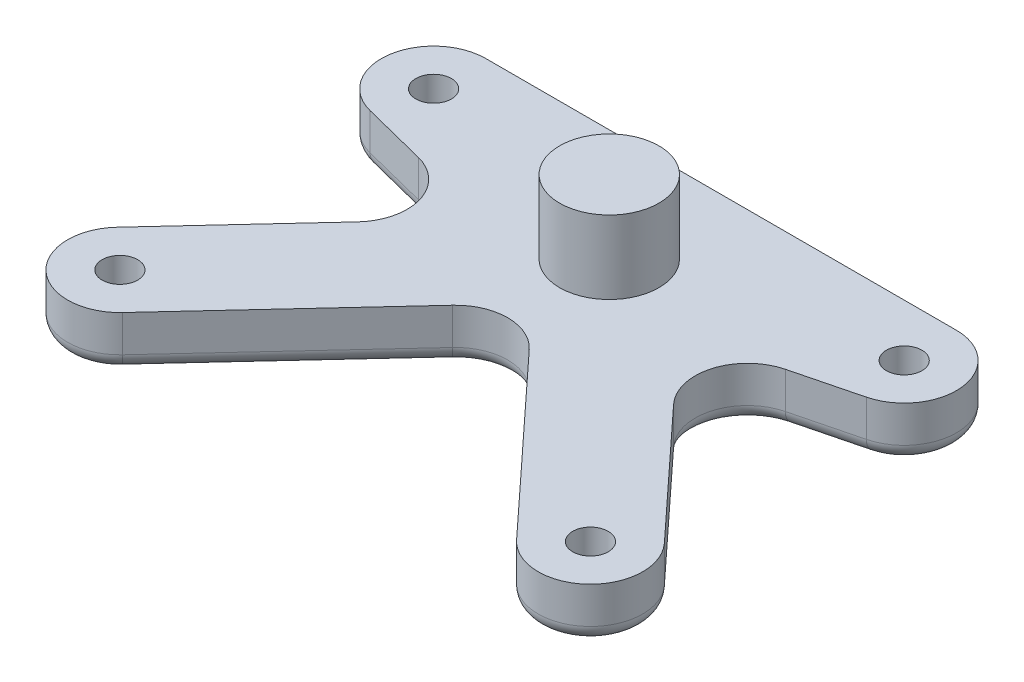
ISO-10303-21;
HEADER;
FILE_DESCRIPTION(('STEP AP214'),'2;1');
FILE_NAME('part.step','',(''),(''),'','','');
FILE_SCHEMA(('AUTOMOTIVE_DESIGN { 1 0 10303 214 1 1 1 1 }'));
ENDSEC;
DATA;
#1=APPLICATION_CONTEXT('core data for automotive mechanical design processes');
#2=APPLICATION_PROTOCOL_DEFINITION('international standard','automotive_design',2000,#1);
#3=PRODUCT_CONTEXT('',#1,'mechanical');
#4=PRODUCT('Part','Part','',(#3));
#5=PRODUCT_RELATED_PRODUCT_CATEGORY('part','',(#4));
#6=PRODUCT_DEFINITION_FORMATION('','',#4);
#7=PRODUCT_DEFINITION_CONTEXT('part definition',#1,'design');
#8=PRODUCT_DEFINITION('design','',#6,#7);
#9=PRODUCT_DEFINITION_SHAPE('','',#8);
#10=(LENGTH_UNIT() NAMED_UNIT(*) SI_UNIT(.MILLI.,.METRE.));
#11=(NAMED_UNIT(*) PLANE_ANGLE_UNIT() SI_UNIT($,.RADIAN.));
#12=(NAMED_UNIT(*) SI_UNIT($,.STERADIAN.) SOLID_ANGLE_UNIT());
#13=UNCERTAINTY_MEASURE_WITH_UNIT(LENGTH_MEASURE(1.E-05),#10,'distance_accuracy_value','');
#14=(GEOMETRIC_REPRESENTATION_CONTEXT(3) GLOBAL_UNCERTAINTY_ASSIGNED_CONTEXT((#13)) GLOBAL_UNIT_ASSIGNED_CONTEXT((#10,
#11,#12)) REPRESENTATION_CONTEXT('',''));
#15=CARTESIAN_POINT('',(0.,0.,0.));
#16=DIRECTION('',(0.,0.,1.));
#17=DIRECTION('',(1.,0.,0.));
#18=AXIS2_PLACEMENT_3D('',#15,#16,#17);
#19=CARTESIAN_POINT('',(-22.5,5.,15.));
#20=DIRECTION('',(0.,1.,0.));
#21=DIRECTION('',(0.,0.,1.));
#22=AXIS2_PLACEMENT_3D('',#19,#20,#21);
#23=PLANE('',#22);
#24=CARTESIAN_POINT('',(0.,5.,-9.3));
#25=DIRECTION('',(0.,1.,0.));
#26=DIRECTION('',(0.,0.,1.));
#27=AXIS2_PLACEMENT_3D('',#24,#25,#26);
#28=CIRCLE('',#27,4.75);
#29=CARTESIAN_POINT('',(0.,5.,-4.55));
#30=VERTEX_POINT('',#29);
#31=EDGE_CURVE('E355',#30,#30,#28,.T.);
#32=ORIENTED_EDGE('',*,*,#31,.F.);
#33=EDGE_LOOP('',(#32));
#34=FACE_BOUND('',#33,.T.);
#35=CARTESIAN_POINT('',(-22.5,5.,-15.));
#36=DIRECTION('',(0.,1.,0.));
#37=DIRECTION('',(0.,0.,1.));
#38=AXIS2_PLACEMENT_3D('',#35,#36,#37);
#39=CIRCLE('',#38,1.7);
#40=CARTESIAN_POINT('',(-22.5,5.,-13.3));
#41=VERTEX_POINT('',#40);
#42=EDGE_CURVE('E379',#41,#41,#39,.T.);
#43=ORIENTED_EDGE('',*,*,#42,.F.);
#44=EDGE_LOOP('',(#43));
#45=FACE_BOUND('',#44,.T.);
#46=CARTESIAN_POINT('',(22.5,5.,-15.));
#47=DIRECTION('',(0.,1.,0.));
#48=DIRECTION('',(0.,0.,1.));
#49=AXIS2_PLACEMENT_3D('',#46,#47,#48);
#50=CIRCLE('',#49,1.69999999999999);
#51=CARTESIAN_POINT('',(22.5,5.,-13.3));
#52=VERTEX_POINT('',#51);
#53=EDGE_CURVE('E209',#52,#52,#50,.T.);
#54=ORIENTED_EDGE('',*,*,#53,.F.);
#55=EDGE_LOOP('',(#54));
#56=FACE_BOUND('',#55,.T.);
#57=CARTESIAN_POINT('',(-22.5,5.,15.));
#58=DIRECTION('',(0.,1.,0.));
#59=DIRECTION('',(0.,0.,1.));
#60=AXIS2_PLACEMENT_3D('',#57,#58,#59);
#61=CIRCLE('',#60,5.00000000000001);
#62=CARTESIAN_POINT('',(-26.1688033700915,5.,11.6029598425089));
#63=VERTEX_POINT('',#62);
#64=CARTESIAN_POINT('',(-18.8311966299096,5.,18.3970401574917));
#65=VERTEX_POINT('',#64);
#66=EDGE_CURVE('E199',#63,#65,#61,.T.);
#67=ORIENTED_EDGE('',*,*,#66,.T.);
#68=DIRECTION('',(0.679408031498311,0.,-0.733760674018164));
#69=VECTOR('',#68,1.);
#70=CARTESIAN_POINT('',(-18.8311966299096,5.,18.3970401574917));
#71=LINE('',#70,#69);
#72=CARTESIAN_POINT('',(-3.66880337009109,5.,2.02165543688799));
#73=VERTEX_POINT('',#72);
#74=EDGE_CURVE('E187',#65,#73,#71,.T.);
#75=ORIENTED_EDGE('',*,*,#74,.T.);
#76=CARTESIAN_POINT('',(0.,5.,5.41869559437926));
#77=DIRECTION('',(0.,-1.,0.));
#78=DIRECTION('',(0.,0.,1.));
#79=AXIS2_PLACEMENT_3D('',#76,#77,#78);
#80=CIRCLE('',#79,5.);
#81=CARTESIAN_POINT('',(3.66880337009086,5.,2.02165543688777));
#82=VERTEX_POINT('',#81);
#83=EDGE_CURVE('E198',#73,#82,#80,.T.);
#84=ORIENTED_EDGE('',*,*,#83,.T.);
#85=DIRECTION('',(0.679408031498305,0.,0.733760674018169));
#86=VECTOR('',#85,1.);
#87=CARTESIAN_POINT('',(3.66880337009086,5.,2.02165543688777));
#88=LINE('',#87,#86);
#89=CARTESIAN_POINT('',(18.8311966299092,5.,18.3970401574915));
#90=VERTEX_POINT('',#89);
#91=EDGE_CURVE('E403',#82,#90,#88,.T.);
#92=ORIENTED_EDGE('',*,*,#91,.T.);
#93=CARTESIAN_POINT('',(22.5,5.,15.));
#94=DIRECTION('',(0.,1.,0.));
#95=DIRECTION('',(0.,0.,1.));
#96=AXIS2_PLACEMENT_3D('',#93,#94,#95);
#97=CIRCLE('',#96,5.);
#98=CARTESIAN_POINT('',(26.1688033700909,5.,11.6029598425085));
#99=VERTEX_POINT('',#98);
#100=EDGE_CURVE('E406',#90,#99,#97,.T.);
#101=ORIENTED_EDGE('',*,*,#100,.T.);
#102=DIRECTION('',(-0.679408031498341,0.,-0.733760674018136));
#103=VECTOR('',#102,1.);
#104=CARTESIAN_POINT('',(15.1071427792466,5.,-0.343633595602185));
#105=LINE('',#104,#103);
#106=CARTESIAN_POINT('',(15.1071427792465,5.,-0.34363359560214));
#107=VERTEX_POINT('',#106);
#108=EDGE_CURVE('E409',#99,#107,#105,.T.);
#109=ORIENTED_EDGE('',*,*,#108,.T.);
#110=CARTESIAN_POINT('',(18.7759461493373,5.,-3.74067375309363));
#111=DIRECTION('',(0.,-1.,0.));
#112=DIRECTION('',(0.,0.,-1.));
#113=AXIS2_PLACEMENT_3D('',#110,#111,#112);
#114=CIRCLE('',#113,4.99999999999995);
#115=CARTESIAN_POINT('',(17.5480680619874,5.,-8.58756094000093));
#116=VERTEX_POINT('',#115);
#117=EDGE_CURVE('E412',#107,#116,#114,.T.);
#118=ORIENTED_EDGE('',*,*,#117,.T.);
#119=DIRECTION('',(0.969377437381459,0.,-0.245575617469966));
#120=VECTOR('',#119,1.);
#121=CARTESIAN_POINT('',(23.7278780873499,5.,-10.1531128130927));
#122=LINE('',#121,#120);
#123=CARTESIAN_POINT('',(23.7278780873499,5.,-10.1531128130927));
#124=VERTEX_POINT('',#123);
#125=EDGE_CURVE('E415',#116,#124,#122,.T.);
#126=ORIENTED_EDGE('',*,*,#125,.T.);
#127=CARTESIAN_POINT('',(22.5,5.,-15.));
#128=DIRECTION('',(0.,1.,0.));
#129=DIRECTION('',(0.,0.,1.));
#130=AXIS2_PLACEMENT_3D('',#127,#128,#129);
#131=CIRCLE('',#130,5.);
#132=CARTESIAN_POINT('',(22.5,5.,-20.));
#133=VERTEX_POINT('',#132);
#134=EDGE_CURVE('E418',#124,#133,#131,.T.);
#135=ORIENTED_EDGE('',*,*,#134,.T.);
#136=DIRECTION('',(-1.,0.,0.));
#137=VECTOR('',#136,1.);
#138=CARTESIAN_POINT('',(-22.5,5.,-20.));
#139=LINE('',#138,#137);
#140=CARTESIAN_POINT('',(-22.5,5.,-20.));
#141=VERTEX_POINT('',#140);
#142=EDGE_CURVE('E421',#133,#141,#139,.T.);
#143=ORIENTED_EDGE('',*,*,#142,.T.);
#144=CARTESIAN_POINT('',(-22.5,5.,-15.));
#145=DIRECTION('',(0.,1.,0.));
#146=DIRECTION('',(0.,0.,1.));
#147=AXIS2_PLACEMENT_3D('',#144,#145,#146);
#148=CIRCLE('',#147,5.);
#149=CARTESIAN_POINT('',(-23.7278780873506,5.,-10.1531128130929));
#150=VERTEX_POINT('',#149);
#151=EDGE_CURVE('E424',#141,#150,#148,.T.);
#152=ORIENTED_EDGE('',*,*,#151,.T.);
#153=DIRECTION('',(0.969377437381453,0.,0.245575617469989));
#154=VECTOR('',#153,1.);
#155=CARTESIAN_POINT('',(-23.7278780873506,5.,-10.1531128130929));
#156=LINE('',#155,#154);
#157=CARTESIAN_POINT('',(-17.5480680619892,5.,-8.58756094000132));
#158=VERTEX_POINT('',#157);
#159=EDGE_CURVE('E427',#150,#158,#156,.T.);
#160=ORIENTED_EDGE('',*,*,#159,.T.);
#161=CARTESIAN_POINT('',(-18.7759461493394,5.,-3.74067375309387));
#162=DIRECTION('',(0.,-1.,0.));
#163=DIRECTION('',(0.,0.,1.));
#164=AXIS2_PLACEMENT_3D('',#161,#162,#163);
#165=CIRCLE('',#164,5.00000000000022);
#166=CARTESIAN_POINT('',(-15.107142779248,5.,-0.343633595602444));
#167=VERTEX_POINT('',#166);
#168=EDGE_CURVE('E430',#158,#167,#165,.T.);
#169=ORIENTED_EDGE('',*,*,#168,.T.);
#170=DIRECTION('',(-0.679408031498295,0.,0.733760674018178));
#171=VECTOR('',#170,1.);
#172=CARTESIAN_POINT('',(-26.1688033700915,5.,11.6029598425089));
#173=LINE('',#172,#171);
#174=EDGE_CURVE('E204',#167,#63,#173,.T.);
#175=ORIENTED_EDGE('',*,*,#174,.T.);
#176=EDGE_LOOP('',(#67,#75,#84,#92,#101,#109,#118,#126,#135,#143,#152,#160,#169,#175));
#177=FACE_BOUND('',#176,.T.);
#178=CARTESIAN_POINT('',(22.5,5.,15.));
#179=DIRECTION('',(0.,1.,0.));
#180=DIRECTION('',(0.,0.,1.));
#181=AXIS2_PLACEMENT_3D('',#178,#179,#180);
#182=CIRCLE('',#181,1.7);
#183=CARTESIAN_POINT('',(22.5,5.,16.7));
#184=VERTEX_POINT('',#183);
#185=EDGE_CURVE('E387',#184,#184,#182,.T.);
#186=ORIENTED_EDGE('',*,*,#185,.F.);
#187=EDGE_LOOP('',(#186));
#188=FACE_BOUND('',#187,.T.);
#189=CARTESIAN_POINT('',(-22.5,5.,15.));
#190=DIRECTION('',(0.,1.,0.));
#191=DIRECTION('',(0.,0.,1.));
#192=AXIS2_PLACEMENT_3D('',#189,#190,#191);
#193=CIRCLE('',#192,1.7);
#194=CARTESIAN_POINT('',(-22.5,5.,16.7));
#195=VERTEX_POINT('',#194);
#196=EDGE_CURVE('E371',#195,#195,#193,.T.);
#197=ORIENTED_EDGE('',*,*,#196,.F.);
#198=EDGE_LOOP('',(#197));
#199=FACE_BOUND('',#198,.T.);
#200=ADVANCED_FACE('F41',(#34,#45,#56,#177,#188,#199),#23,.T.);
#201=CARTESIAN_POINT('',(-22.5,0.,15.));
#202=DIRECTION('',(0.,1.,0.));
#203=DIRECTION('',(0.,0.,1.));
#204=AXIS2_PLACEMENT_3D('',#201,#202,#203);
#205=PLANE('',#204);
#206=DIRECTION('',(-1.,0.,0.));
#207=VECTOR('',#206,1.);
#208=CARTESIAN_POINT('',(-22.5,0.,-18.5));
#209=LINE('',#208,#207);
#210=CARTESIAN_POINT('',(-22.5,0.,-18.5));
#211=VERTEX_POINT('',#210);
#212=CARTESIAN_POINT('',(22.5,0.,-18.5));
#213=VERTEX_POINT('',#212);
#214=EDGE_CURVE('E220',#211,#213,#209,.F.);
#215=ORIENTED_EDGE('',*,*,#214,.T.);
#216=CARTESIAN_POINT('',(22.5,0.,-15.));
#217=DIRECTION('',(0.,1.,0.));
#218=DIRECTION('',(0.,0.,1.));
#219=AXIS2_PLACEMENT_3D('',#216,#217,#218);
#220=CIRCLE('',#219,3.5);
#221=CARTESIAN_POINT('',(23.3595146611449,0.,-11.6071789691649));
#222=VERTEX_POINT('',#221);
#223=EDGE_CURVE('E264',#213,#222,#220,.F.);
#224=ORIENTED_EDGE('',*,*,#223,.T.);
#225=DIRECTION('',(0.969377437381459,0.,-0.245575617469966));
#226=VECTOR('',#225,1.);
#227=CARTESIAN_POINT('',(-26.0683169459383,0.,0.914538371295966));
#228=LINE('',#227,#226);
#229=CARTESIAN_POINT('',(17.1797046357825,0.,-10.0416270960731));
#230=VERTEX_POINT('',#229);
#231=EDGE_CURVE('E261',#222,#230,#228,.F.);
#232=ORIENTED_EDGE('',*,*,#231,.T.);
#233=CARTESIAN_POINT('',(18.7759461493373,0.,-3.74067375309363));
#234=DIRECTION('',(0.,1.,0.));
#235=DIRECTION('',(0.,0.,1.));
#236=AXIS2_PLACEMENT_3D('',#233,#234,#235);
#237=CIRCLE('',#236,6.49999999999995);
#238=CARTESIAN_POINT('',(14.0065017682193,0.,0.675478451645273));
#239=VERTEX_POINT('',#238);
#240=EDGE_CURVE('E258',#230,#239,#237,.T.);
#241=ORIENTED_EDGE('',*,*,#240,.T.);
#242=DIRECTION('',(-0.679408031498341,0.,-0.733760674018136));
#243=VECTOR('',#242,1.);
#244=CARTESIAN_POINT('',(4.29637506216319,0.,-9.8114583908943));
#245=LINE('',#244,#243);
#246=CARTESIAN_POINT('',(25.0681623590636,0.,12.622071889756));
#247=VERTEX_POINT('',#246);
#248=EDGE_CURVE('E255',#239,#247,#245,.F.);
#249=ORIENTED_EDGE('',*,*,#248,.T.);
#250=CARTESIAN_POINT('',(22.5,0.,15.));
#251=DIRECTION('',(0.,1.,0.));
#252=DIRECTION('',(0.,0.,1.));
#253=AXIS2_PLACEMENT_3D('',#250,#251,#252);
#254=CIRCLE('',#253,3.5);
#255=CARTESIAN_POINT('',(19.9318376409364,0.,17.3779281102441));
#256=VERTEX_POINT('',#255);
#257=EDGE_CURVE('E252',#247,#256,#254,.F.);
#258=ORIENTED_EDGE('',*,*,#257,.T.);
#259=DIRECTION('',(0.679408031498305,0.,0.733760674018169));
#260=VECTOR('',#259,1.);
#261=CARTESIAN_POINT('',(-0.839949655961663,0.,-5.05560217040586));
#262=LINE('',#261,#260);
#263=CARTESIAN_POINT('',(4.76944438111811,0.,1.00254338964031));
#264=VERTEX_POINT('',#263);
#265=EDGE_CURVE('E249',#256,#264,#262,.F.);
#266=ORIENTED_EDGE('',*,*,#265,.T.);
#267=CARTESIAN_POINT('',(0.,0.,5.41869559437926));
#268=DIRECTION('',(0.,1.,0.));
#269=DIRECTION('',(0.,0.,1.));
#270=AXIS2_PLACEMENT_3D('',#267,#268,#269);
#271=CIRCLE('',#270,6.5);
#272=CARTESIAN_POINT('',(-4.76944438111841,0.,1.00254338964061));
#273=VERTEX_POINT('',#272);
#274=EDGE_CURVE('E246',#264,#273,#271,.T.);
#275=ORIENTED_EDGE('',*,*,#274,.T.);
#276=DIRECTION('',(0.679408031498311,0.,-0.733760674018164));
#277=VECTOR('',#276,1.);
#278=CARTESIAN_POINT('',(-19.9318376409366,0.,17.377928110244));
#279=LINE('',#278,#277);
#280=CARTESIAN_POINT('',(-19.9318376409367,0.,17.3779281102444));
#281=VERTEX_POINT('',#280);
#282=EDGE_CURVE('E243',#273,#281,#279,.F.);
#283=ORIENTED_EDGE('',*,*,#282,.T.);
#284=CARTESIAN_POINT('',(-22.5,0.,15.));
#285=DIRECTION('',(0.,1.,0.));
#286=DIRECTION('',(0.,0.,1.));
#287=AXIS2_PLACEMENT_3D('',#284,#285,#286);
#288=CIRCLE('',#287,3.50000000000001);
#289=CARTESIAN_POINT('',(-25.0681623590641,0.,12.6220718897561));
#290=VERTEX_POINT('',#289);
#291=EDGE_CURVE('E240',#281,#290,#288,.F.);
#292=ORIENTED_EDGE('',*,*,#291,.T.);
#293=DIRECTION('',(-0.679408031498295,0.,0.733760674018179));
#294=VECTOR('',#293,1.);
#295=CARTESIAN_POINT('',(-25.0681623590638,0.,12.6220718897558));
#296=LINE('',#295,#294);
#297=CARTESIAN_POINT('',(-14.0065017682208,0.,0.675478451644933));
#298=VERTEX_POINT('',#297);
#299=EDGE_CURVE('E237',#290,#298,#296,.F.);
#300=ORIENTED_EDGE('',*,*,#299,.T.);
#301=CARTESIAN_POINT('',(-18.7759461493394,0.,-3.74067375309387));
#302=DIRECTION('',(0.,1.,0.));
#303=DIRECTION('',(0.,0.,1.));
#304=AXIS2_PLACEMENT_3D('',#301,#302,#303);
#305=CIRCLE('',#304,6.50000000000022);
#306=CARTESIAN_POINT('',(-17.1797046357842,0.,-10.0416270960734));
#307=VERTEX_POINT('',#306);
#308=EDGE_CURVE('E234',#298,#307,#305,.T.);
#309=ORIENTED_EDGE('',*,*,#308,.T.);
#310=DIRECTION('',(0.969377437381454,0.,0.245575617469989));
#311=VECTOR('',#310,1.);
#312=CARTESIAN_POINT('',(-16.2178507787522,0.,-9.79795745229192));
#313=LINE('',#312,#311);
#314=CARTESIAN_POINT('',(-23.3595146611456,0.,-11.6071789691651));
#315=VERTEX_POINT('',#314);
#316=EDGE_CURVE('E231',#307,#315,#313,.F.);
#317=ORIENTED_EDGE('',*,*,#316,.T.);
#318=CARTESIAN_POINT('',(-22.5,0.,-15.));
#319=DIRECTION('',(0.,1.,0.));
#320=DIRECTION('',(0.,0.,1.));
#321=AXIS2_PLACEMENT_3D('',#318,#319,#320);
#322=CIRCLE('',#321,3.5);
#323=EDGE_CURVE('E228',#315,#211,#322,.F.);
#324=ORIENTED_EDGE('',*,*,#323,.T.);
#325=EDGE_LOOP('',(#215,#224,#232,#241,#249,#258,#266,#275,#283,#292,#300,#309,#317,#324));
#326=FACE_BOUND('',#325,.T.);
#327=CARTESIAN_POINT('',(22.5,0.,-15.));
#328=DIRECTION('',(0.,1.,0.));
#329=DIRECTION('',(0.,0.,1.));
#330=AXIS2_PLACEMENT_3D('',#327,#328,#329);
#331=CIRCLE('',#330,1.69999999999999);
#332=CARTESIAN_POINT('',(22.5,0.,-13.3));
#333=VERTEX_POINT('',#332);
#334=EDGE_CURVE('E391',#333,#333,#331,.T.);
#335=ORIENTED_EDGE('',*,*,#334,.T.);
#336=EDGE_LOOP('',(#335));
#337=FACE_BOUND('',#336,.T.);
#338=CARTESIAN_POINT('',(22.5,0.,15.));
#339=DIRECTION('',(0.,1.,0.));
#340=DIRECTION('',(0.,0.,1.));
#341=AXIS2_PLACEMENT_3D('',#338,#339,#340);
#342=CIRCLE('',#341,1.7);
#343=CARTESIAN_POINT('',(22.5,0.,16.7));
#344=VERTEX_POINT('',#343);
#345=EDGE_CURVE('E383',#344,#344,#342,.T.);
#346=ORIENTED_EDGE('',*,*,#345,.T.);
#347=EDGE_LOOP('',(#346));
#348=FACE_BOUND('',#347,.T.);
#349=CARTESIAN_POINT('',(-22.5,0.,-15.));
#350=DIRECTION('',(0.,1.,0.));
#351=DIRECTION('',(0.,0.,1.));
#352=AXIS2_PLACEMENT_3D('',#349,#350,#351);
#353=CIRCLE('',#352,1.7);
#354=CARTESIAN_POINT('',(-22.5,0.,-13.3));
#355=VERTEX_POINT('',#354);
#356=EDGE_CURVE('E375',#355,#355,#353,.T.);
#357=ORIENTED_EDGE('',*,*,#356,.T.);
#358=EDGE_LOOP('',(#357));
#359=FACE_BOUND('',#358,.T.);
#360=CARTESIAN_POINT('',(-22.5,0.,15.));
#361=DIRECTION('',(0.,1.,0.));
#362=DIRECTION('',(0.,0.,1.));
#363=AXIS2_PLACEMENT_3D('',#360,#361,#362);
#364=CIRCLE('',#363,1.7);
#365=CARTESIAN_POINT('',(-22.5,0.,16.7));
#366=VERTEX_POINT('',#365);
#367=EDGE_CURVE('E368',#366,#366,#364,.T.);
#368=ORIENTED_EDGE('',*,*,#367,.T.);
#369=EDGE_LOOP('',(#368));
#370=FACE_BOUND('',#369,.T.);
#371=ADVANCED_FACE('F509',(#326,#337,#348,#359,#370),#205,.F.);
#372=CARTESIAN_POINT('',(-22.5,5.,15.));
#373=DIRECTION('',(0.,-1.,0.));
#374=DIRECTION('',(0.,0.,-1.));
#375=AXIS2_PLACEMENT_3D('',#372,#373,#374);
#376=CYLINDRICAL_SURFACE('',#375,5.00000000000001);
#377=DIRECTION('',(0.,-1.,0.));
#378=VECTOR('',#377,1.);
#379=CARTESIAN_POINT('',(-26.1688033700915,5.,11.6029598425089));
#380=LINE('',#379,#378);
#381=CARTESIAN_POINT('',(-26.1688033700915,1.5,11.6029598425089));
#382=VERTEX_POINT('',#381);
#383=EDGE_CURVE('E435',#63,#382,#380,.T.);
#384=ORIENTED_EDGE('',*,*,#383,.T.);
#385=CARTESIAN_POINT('',(-22.5,1.5,15.));
#386=DIRECTION('',(0.,1.,0.));
#387=DIRECTION('',(0.,0.,1.));
#388=AXIS2_PLACEMENT_3D('',#385,#386,#387);
#389=CIRCLE('',#388,5.00000000000001);
#390=CARTESIAN_POINT('',(-18.8311966299096,1.5,18.3970401574917));
#391=VERTEX_POINT('',#390);
#392=EDGE_CURVE('E213',#382,#391,#389,.T.);
#393=ORIENTED_EDGE('',*,*,#392,.T.);
#394=DIRECTION('',(0.,-1.,0.));
#395=VECTOR('',#394,1.);
#396=CARTESIAN_POINT('',(-18.8311966299096,5.,18.3970401574917));
#397=LINE('',#396,#395);
#398=EDGE_CURVE('E191',#65,#391,#397,.T.);
#399=ORIENTED_EDGE('',*,*,#398,.F.);
#400=ORIENTED_EDGE('',*,*,#66,.F.);
#401=EDGE_LOOP('',(#384,#393,#399,#400));
#402=FACE_BOUND('',#401,.T.);
#403=ADVANCED_FACE('F211',(#402),#376,.T.);
#404=CARTESIAN_POINT('',(-18.8311966299096,5.,18.3970401574917));
#405=DIRECTION('',(-0.733760674018164,0.,-0.679408031498311));
#406=DIRECTION('',(-0.679408031498311,0.,0.733760674018164));
#407=AXIS2_PLACEMENT_3D('',#404,#405,#406);
#408=PLANE('',#407);
#409=ORIENTED_EDGE('',*,*,#398,.T.);
#410=DIRECTION('',(0.679408031498311,0.,-0.733760674018164));
#411=VECTOR('',#410,1.);
#412=CARTESIAN_POINT('',(-18.8311966299096,1.5,18.3970401574917));
#413=LINE('',#412,#411);
#414=CARTESIAN_POINT('',(-3.66880337009109,1.5,2.02165543688799));
#415=VERTEX_POINT('',#414);
#416=EDGE_CURVE('E286',#391,#415,#413,.T.);
#417=ORIENTED_EDGE('',*,*,#416,.T.);
#418=DIRECTION('',(0.,-1.,0.));
#419=VECTOR('',#418,1.);
#420=CARTESIAN_POINT('',(-3.66880337009109,5.,2.02165543688799));
#421=LINE('',#420,#419);
#422=EDGE_CURVE('E194',#73,#415,#421,.T.);
#423=ORIENTED_EDGE('',*,*,#422,.F.);
#424=ORIENTED_EDGE('',*,*,#74,.F.);
#425=EDGE_LOOP('',(#409,#417,#423,#424));
#426=FACE_BOUND('',#425,.T.);
#427=ADVANCED_FACE('F189',(#426),#408,.F.);
#428=CARTESIAN_POINT('',(0.,5.,5.41869559437926));
#429=DIRECTION('',(0.,-1.,0.));
#430=DIRECTION('',(0.,0.,-1.));
#431=AXIS2_PLACEMENT_3D('',#428,#429,#430);
#432=CYLINDRICAL_SURFACE('',#431,5.);
#433=ORIENTED_EDGE('',*,*,#422,.T.);
#434=CARTESIAN_POINT('',(0.,1.5,5.41869559437926));
#435=DIRECTION('',(0.,1.,0.));
#436=DIRECTION('',(0.,0.,1.));
#437=AXIS2_PLACEMENT_3D('',#434,#435,#436);
#438=CIRCLE('',#437,5.);
#439=CARTESIAN_POINT('',(3.66880337009086,1.5,2.02165543688777));
#440=VERTEX_POINT('',#439);
#441=EDGE_CURVE('E283',#415,#440,#438,.F.);
#442=ORIENTED_EDGE('',*,*,#441,.T.);
#443=DIRECTION('',(0.,-1.,0.));
#444=VECTOR('',#443,1.);
#445=CARTESIAN_POINT('',(3.66880337009086,5.,2.02165543688777));
#446=LINE('',#445,#444);
#447=EDGE_CURVE('E222',#82,#440,#446,.T.);
#448=ORIENTED_EDGE('',*,*,#447,.F.);
#449=ORIENTED_EDGE('',*,*,#83,.F.);
#450=EDGE_LOOP('',(#433,#442,#448,#449));
#451=FACE_BOUND('',#450,.T.);
#452=ADVANCED_FACE('F505',(#451),#432,.F.);
#453=CARTESIAN_POINT('',(3.66880337009086,5.,2.02165543688777));
#454=DIRECTION('',(0.733760674018169,0.,-0.679408031498305));
#455=DIRECTION('',(-0.679408031498305,0.,-0.733760674018169));
#456=AXIS2_PLACEMENT_3D('',#453,#454,#455);
#457=PLANE('',#456);
#458=ORIENTED_EDGE('',*,*,#447,.T.);
#459=DIRECTION('',(0.679408031498305,0.,0.733760674018169));
#460=VECTOR('',#459,1.);
#461=CARTESIAN_POINT('',(3.66880337009086,1.5,2.02165543688777));
#462=LINE('',#461,#460);
#463=CARTESIAN_POINT('',(18.8311966299092,1.5,18.3970401574915));
#464=VERTEX_POINT('',#463);
#465=EDGE_CURVE('E280',#440,#464,#462,.T.);
#466=ORIENTED_EDGE('',*,*,#465,.T.);
#467=DIRECTION('',(0.,-1.,0.));
#468=VECTOR('',#467,1.);
#469=CARTESIAN_POINT('',(18.8311966299092,5.,18.3970401574915));
#470=LINE('',#469,#468);
#471=EDGE_CURVE('E471',#90,#464,#470,.T.);
#472=ORIENTED_EDGE('',*,*,#471,.F.);
#473=ORIENTED_EDGE('',*,*,#91,.F.);
#474=EDGE_LOOP('',(#458,#466,#472,#473));
#475=FACE_BOUND('',#474,.T.);
#476=ADVANCED_FACE('F480',(#475),#457,.F.);
#477=CARTESIAN_POINT('',(22.5,5.,15.));
#478=DIRECTION('',(0.,-1.,0.));
#479=DIRECTION('',(0.,0.,-1.));
#480=AXIS2_PLACEMENT_3D('',#477,#478,#479);
#481=CYLINDRICAL_SURFACE('',#480,5.);
#482=ORIENTED_EDGE('',*,*,#471,.T.);
#483=CARTESIAN_POINT('',(22.5,1.5,15.));
#484=DIRECTION('',(0.,1.,0.));
#485=DIRECTION('',(0.,0.,1.));
#486=AXIS2_PLACEMENT_3D('',#483,#484,#485);
#487=CIRCLE('',#486,5.);
#488=CARTESIAN_POINT('',(26.1688033700909,1.5,11.6029598425085));
#489=VERTEX_POINT('',#488);
#490=EDGE_CURVE('E277',#464,#489,#487,.T.);
#491=ORIENTED_EDGE('',*,*,#490,.T.);
#492=DIRECTION('',(0.,-1.,0.));
#493=VECTOR('',#492,1.);
#494=CARTESIAN_POINT('',(26.1688033700909,5.,11.6029598425085));
#495=LINE('',#494,#493);
#496=EDGE_CURVE('E467',#99,#489,#495,.T.);
#497=ORIENTED_EDGE('',*,*,#496,.F.);
#498=ORIENTED_EDGE('',*,*,#100,.F.);
#499=EDGE_LOOP('',(#482,#491,#497,#498));
#500=FACE_BOUND('',#499,.T.);
#501=ADVANCED_FACE('F497',(#500),#481,.T.);
#502=CARTESIAN_POINT('',(15.1071427792466,5.,-0.343633595602185));
#503=DIRECTION('',(-0.733760674018136,0.,0.679408031498341));
#504=DIRECTION('',(0.679408031498341,0.,0.733760674018136));
#505=AXIS2_PLACEMENT_3D('',#502,#503,#504);
#506=PLANE('',#505);
#507=ORIENTED_EDGE('',*,*,#496,.T.);
#508=DIRECTION('',(-0.679408031498341,0.,-0.733760674018136));
#509=VECTOR('',#508,1.);
#510=CARTESIAN_POINT('',(15.1071427792466,1.5,-0.343633595602185));
#511=LINE('',#510,#509);
#512=CARTESIAN_POINT('',(15.1071427792465,1.5,-0.34363359560214));
#513=VERTEX_POINT('',#512);
#514=EDGE_CURVE('E274',#489,#513,#511,.T.);
#515=ORIENTED_EDGE('',*,*,#514,.T.);
#516=DIRECTION('',(0.,-1.,0.));
#517=VECTOR('',#516,1.);
#518=CARTESIAN_POINT('',(15.1071427792465,5.,-0.34363359560214));
#519=LINE('',#518,#517);
#520=EDGE_CURVE('E463',#107,#513,#519,.T.);
#521=ORIENTED_EDGE('',*,*,#520,.F.);
#522=ORIENTED_EDGE('',*,*,#108,.F.);
#523=EDGE_LOOP('',(#507,#515,#521,#522));
#524=FACE_BOUND('',#523,.T.);
#525=ADVANCED_FACE('F501',(#524),#506,.F.);
#526=CARTESIAN_POINT('',(18.7759461493373,5.,-3.74067375309363));
#527=DIRECTION('',(0.,-1.,0.));
#528=DIRECTION('',(0.,0.,-1.));
#529=AXIS2_PLACEMENT_3D('',#526,#527,#528);
#530=CYLINDRICAL_SURFACE('',#529,4.99999999999995);
#531=ORIENTED_EDGE('',*,*,#520,.T.);
#532=CARTESIAN_POINT('',(18.7759461493373,1.5,-3.74067375309363));
#533=DIRECTION('',(0.,1.,0.));
#534=DIRECTION('',(0.,0.,1.));
#535=AXIS2_PLACEMENT_3D('',#532,#533,#534);
#536=CIRCLE('',#535,4.99999999999995);
#537=CARTESIAN_POINT('',(17.5480680619874,1.5,-8.58756094000093));
#538=VERTEX_POINT('',#537);
#539=EDGE_CURVE('E271',#513,#538,#536,.F.);
#540=ORIENTED_EDGE('',*,*,#539,.T.);
#541=DIRECTION('',(0.,-1.,0.));
#542=VECTOR('',#541,1.);
#543=CARTESIAN_POINT('',(17.5480680619874,5.,-8.58756094000093));
#544=LINE('',#543,#542);
#545=EDGE_CURVE('E459',#116,#538,#544,.T.);
#546=ORIENTED_EDGE('',*,*,#545,.F.);
#547=ORIENTED_EDGE('',*,*,#117,.F.);
#548=EDGE_LOOP('',(#531,#540,#546,#547));
#549=FACE_BOUND('',#548,.T.);
#550=ADVANCED_FACE('F523',(#549),#530,.F.);
#551=CARTESIAN_POINT('',(23.7278780873499,5.,-10.1531128130927));
#552=DIRECTION('',(-0.245575617469966,0.,-0.969377437381459));
#553=DIRECTION('',(-0.969377437381459,0.,0.245575617469966));
#554=AXIS2_PLACEMENT_3D('',#551,#552,#553);
#555=PLANE('',#554);
#556=ORIENTED_EDGE('',*,*,#545,.T.);
#557=DIRECTION('',(0.969377437381459,0.,-0.245575617469966));
#558=VECTOR('',#557,1.);
#559=CARTESIAN_POINT('',(23.7278780873499,1.5,-10.1531128130927));
#560=LINE('',#559,#558);
#561=CARTESIAN_POINT('',(23.7278780873499,1.5,-10.1531128130927));
#562=VERTEX_POINT('',#561);
#563=EDGE_CURVE('E268',#538,#562,#560,.T.);
#564=ORIENTED_EDGE('',*,*,#563,.T.);
#565=DIRECTION('',(0.,-1.,0.));
#566=VECTOR('',#565,1.);
#567=CARTESIAN_POINT('',(23.7278780873499,5.,-10.1531128130927));
#568=LINE('',#567,#566);
#569=EDGE_CURVE('E455',#124,#562,#568,.T.);
#570=ORIENTED_EDGE('',*,*,#569,.F.);
#571=ORIENTED_EDGE('',*,*,#125,.F.);
#572=EDGE_LOOP('',(#556,#564,#570,#571));
#573=FACE_BOUND('',#572,.T.);
#574=ADVANCED_FACE('F526',(#573),#555,.F.);
#575=CARTESIAN_POINT('',(22.5,5.,-15.));
#576=DIRECTION('',(0.,-1.,0.));
#577=DIRECTION('',(0.,0.,-1.));
#578=AXIS2_PLACEMENT_3D('',#575,#576,#577);
#579=CYLINDRICAL_SURFACE('',#578,5.);
#580=ORIENTED_EDGE('',*,*,#569,.T.);
#581=CARTESIAN_POINT('',(22.5,1.5,-15.));
#582=DIRECTION('',(0.,1.,0.));
#583=DIRECTION('',(0.,0.,1.));
#584=AXIS2_PLACEMENT_3D('',#581,#582,#583);
#585=CIRCLE('',#584,5.);
#586=CARTESIAN_POINT('',(22.5,1.5,-20.));
#587=VERTEX_POINT('',#586);
#588=EDGE_CURVE('E215',#562,#587,#585,.T.);
#589=ORIENTED_EDGE('',*,*,#588,.T.);
#590=DIRECTION('',(0.,-1.,0.));
#591=VECTOR('',#590,1.);
#592=CARTESIAN_POINT('',(22.5,5.,-20.));
#593=LINE('',#592,#591);
#594=EDGE_CURVE('E452',#133,#587,#593,.T.);
#595=ORIENTED_EDGE('',*,*,#594,.F.);
#596=ORIENTED_EDGE('',*,*,#134,.F.);
#597=EDGE_LOOP('',(#580,#589,#595,#596));
#598=FACE_BOUND('',#597,.T.);
#599=ADVANCED_FACE('F532',(#598),#579,.T.);
#600=CARTESIAN_POINT('',(-22.5,5.,-20.));
#601=DIRECTION('',(0.,0.,1.));
#602=DIRECTION('',(1.,0.,0.));
#603=AXIS2_PLACEMENT_3D('',#600,#601,#602);
#604=PLANE('',#603);
#605=ORIENTED_EDGE('',*,*,#594,.T.);
#606=DIRECTION('',(-1.,0.,0.));
#607=VECTOR('',#606,1.);
#608=CARTESIAN_POINT('',(-22.5,1.5,-20.));
#609=LINE('',#608,#607);
#610=CARTESIAN_POINT('',(-22.5,1.5,-20.));
#611=VERTEX_POINT('',#610);
#612=EDGE_CURVE('E11',#587,#611,#609,.T.);
#613=ORIENTED_EDGE('',*,*,#612,.T.);
#614=DIRECTION('',(0.,-1.,0.));
#615=VECTOR('',#614,1.);
#616=CARTESIAN_POINT('',(-22.5,5.,-20.));
#617=LINE('',#616,#615);
#618=EDGE_CURVE('E449',#141,#611,#617,.T.);
#619=ORIENTED_EDGE('',*,*,#618,.F.);
#620=ORIENTED_EDGE('',*,*,#142,.F.);
#621=EDGE_LOOP('',(#605,#613,#619,#620));
#622=FACE_BOUND('',#621,.T.);
#623=ADVANCED_FACE('F534',(#622),#604,.F.);
#624=CARTESIAN_POINT('',(-22.5,5.,-15.));
#625=DIRECTION('',(0.,-1.,0.));
#626=DIRECTION('',(0.,0.,-1.));
#627=AXIS2_PLACEMENT_3D('',#624,#625,#626);
#628=CYLINDRICAL_SURFACE('',#627,5.);
#629=ORIENTED_EDGE('',*,*,#618,.T.);
#630=CARTESIAN_POINT('',(-22.5,1.5,-15.));
#631=DIRECTION('',(0.,1.,0.));
#632=DIRECTION('',(0.,0.,1.));
#633=AXIS2_PLACEMENT_3D('',#630,#631,#632);
#634=CIRCLE('',#633,5.);
#635=CARTESIAN_POINT('',(-23.7278780873506,1.5,-10.1531128130929));
#636=VERTEX_POINT('',#635);
#637=EDGE_CURVE('E51',#611,#636,#634,.T.);
#638=ORIENTED_EDGE('',*,*,#637,.T.);
#639=DIRECTION('',(0.,-1.,0.));
#640=VECTOR('',#639,1.);
#641=CARTESIAN_POINT('',(-23.7278780873506,5.,-10.1531128130929));
#642=LINE('',#641,#640);
#643=EDGE_CURVE('E446',#150,#636,#642,.T.);
#644=ORIENTED_EDGE('',*,*,#643,.F.);
#645=ORIENTED_EDGE('',*,*,#151,.F.);
#646=EDGE_LOOP('',(#629,#638,#644,#645));
#647=FACE_BOUND('',#646,.T.);
#648=ADVANCED_FACE('F536',(#647),#628,.T.);
#649=CARTESIAN_POINT('',(-23.7278780873506,5.,-10.1531128130929));
#650=DIRECTION('',(0.245575617469989,0.,-0.969377437381454));
#651=DIRECTION('',(-0.969377437381454,0.,-0.245575617469989));
#652=AXIS2_PLACEMENT_3D('',#649,#650,#651);
#653=PLANE('',#652);
#654=ORIENTED_EDGE('',*,*,#643,.T.);
#655=DIRECTION('',(0.969377437381454,0.,0.245575617469989));
#656=VECTOR('',#655,1.);
#657=CARTESIAN_POINT('',(-23.7278780873506,1.5,-10.1531128130929));
#658=LINE('',#657,#656);
#659=CARTESIAN_POINT('',(-17.5480680619892,1.5,-8.58756094000132));
#660=VERTEX_POINT('',#659);
#661=EDGE_CURVE('E297',#636,#660,#658,.T.);
#662=ORIENTED_EDGE('',*,*,#661,.T.);
#663=DIRECTION('',(0.,-1.,0.));
#664=VECTOR('',#663,1.);
#665=CARTESIAN_POINT('',(-17.5480680619892,5.,-8.58756094000132));
#666=LINE('',#665,#664);
#667=EDGE_CURVE('E442',#158,#660,#666,.T.);
#668=ORIENTED_EDGE('',*,*,#667,.F.);
#669=ORIENTED_EDGE('',*,*,#159,.F.);
#670=EDGE_LOOP('',(#654,#662,#668,#669));
#671=FACE_BOUND('',#670,.T.);
#672=ADVANCED_FACE('F542',(#671),#653,.F.);
#673=CARTESIAN_POINT('',(-18.7759461493394,5.,-3.74067375309387));
#674=DIRECTION('',(0.,-1.,0.));
#675=DIRECTION('',(0.,0.,-1.));
#676=AXIS2_PLACEMENT_3D('',#673,#674,#675);
#677=CYLINDRICAL_SURFACE('',#676,5.00000000000022);
#678=ORIENTED_EDGE('',*,*,#667,.T.);
#679=CARTESIAN_POINT('',(-18.7759461493394,1.5,-3.74067375309387));
#680=DIRECTION('',(0.,1.,0.));
#681=DIRECTION('',(0.,0.,1.));
#682=AXIS2_PLACEMENT_3D('',#679,#680,#681);
#683=CIRCLE('',#682,5.00000000000022);
#684=CARTESIAN_POINT('',(-15.107142779248,1.5,-0.343633595602444));
#685=VERTEX_POINT('',#684);
#686=EDGE_CURVE('E294',#660,#685,#683,.F.);
#687=ORIENTED_EDGE('',*,*,#686,.T.);
#688=DIRECTION('',(0.,-1.,0.));
#689=VECTOR('',#688,1.);
#690=CARTESIAN_POINT('',(-15.107142779248,5.,-0.343633595602444));
#691=LINE('',#690,#689);
#692=EDGE_CURVE('E438',#167,#685,#691,.T.);
#693=ORIENTED_EDGE('',*,*,#692,.F.);
#694=ORIENTED_EDGE('',*,*,#168,.F.);
#695=EDGE_LOOP('',(#678,#687,#693,#694));
#696=FACE_BOUND('',#695,.T.);
#697=ADVANCED_FACE('F546',(#696),#677,.F.);
#698=CARTESIAN_POINT('',(-26.1688033700915,5.,11.6029598425089));
#699=DIRECTION('',(0.733760674018178,0.,0.679408031498295));
#700=DIRECTION('',(0.679408031498295,0.,-0.733760674018179));
#701=AXIS2_PLACEMENT_3D('',#698,#699,#700);
#702=PLANE('',#701);
#703=ORIENTED_EDGE('',*,*,#692,.T.);
#704=DIRECTION('',(-0.679408031498295,0.,0.733760674018179));
#705=VECTOR('',#704,1.);
#706=CARTESIAN_POINT('',(-26.1688033700915,1.5,11.6029598425089));
#707=LINE('',#706,#705);
#708=EDGE_CURVE('E291',#685,#382,#707,.T.);
#709=ORIENTED_EDGE('',*,*,#708,.T.);
#710=ORIENTED_EDGE('',*,*,#383,.F.);
#711=ORIENTED_EDGE('',*,*,#174,.F.);
#712=EDGE_LOOP('',(#703,#709,#710,#711));
#713=FACE_BOUND('',#712,.T.);
#714=ADVANCED_FACE('F549',(#713),#702,.F.);
#715=CARTESIAN_POINT('',(22.5,5.,-15.));
#716=DIRECTION('',(0.,-1.,0.));
#717=DIRECTION('',(0.,0.,-1.));
#718=AXIS2_PLACEMENT_3D('',#715,#716,#717);
#719=CYLINDRICAL_SURFACE('',#718,1.69999999999999);
#720=ORIENTED_EDGE('',*,*,#53,.T.);
#721=EDGE_LOOP('',(#720));
#722=FACE_BOUND('',#721,.T.);
#723=ORIENTED_EDGE('',*,*,#334,.F.);
#724=EDGE_LOOP('',(#723));
#725=FACE_BOUND('',#724,.T.);
#726=ADVANCED_FACE('F595',(#722,#725),#719,.F.);
#727=CARTESIAN_POINT('',(22.5,5.,15.));
#728=DIRECTION('',(0.,-1.,0.));
#729=DIRECTION('',(0.,0.,-1.));
#730=AXIS2_PLACEMENT_3D('',#727,#728,#729);
#731=CYLINDRICAL_SURFACE('',#730,1.7);
#732=ORIENTED_EDGE('',*,*,#185,.T.);
#733=EDGE_LOOP('',(#732));
#734=FACE_BOUND('',#733,.T.);
#735=ORIENTED_EDGE('',*,*,#345,.F.);
#736=EDGE_LOOP('',(#735));
#737=FACE_BOUND('',#736,.T.);
#738=ADVANCED_FACE('F688',(#734,#737),#731,.F.);
#739=CARTESIAN_POINT('',(-22.5,5.,-15.));
#740=DIRECTION('',(0.,-1.,0.));
#741=DIRECTION('',(0.,0.,-1.));
#742=AXIS2_PLACEMENT_3D('',#739,#740,#741);
#743=CYLINDRICAL_SURFACE('',#742,1.7);
#744=ORIENTED_EDGE('',*,*,#42,.T.);
#745=EDGE_LOOP('',(#744));
#746=FACE_BOUND('',#745,.T.);
#747=ORIENTED_EDGE('',*,*,#356,.F.);
#748=EDGE_LOOP('',(#747));
#749=FACE_BOUND('',#748,.T.);
#750=ADVANCED_FACE('F695',(#746,#749),#743,.F.);
#751=CARTESIAN_POINT('',(-22.5,5.,15.));
#752=DIRECTION('',(0.,-1.,0.));
#753=DIRECTION('',(0.,0.,-1.));
#754=AXIS2_PLACEMENT_3D('',#751,#752,#753);
#755=CYLINDRICAL_SURFACE('',#754,1.7);
#756=ORIENTED_EDGE('',*,*,#196,.T.);
#757=EDGE_LOOP('',(#756));
#758=FACE_BOUND('',#757,.T.);
#759=ORIENTED_EDGE('',*,*,#367,.F.);
#760=EDGE_LOOP('',(#759));
#761=FACE_BOUND('',#760,.T.);
#762=ADVANCED_FACE('F702',(#758,#761),#755,.F.);
#763=CARTESIAN_POINT('',(0.,12.,-9.3));
#764=DIRECTION('',(0.,-1.,0.));
#765=DIRECTION('',(0.,0.,-1.));
#766=AXIS2_PLACEMENT_3D('',#763,#764,#765);
#767=CYLINDRICAL_SURFACE('',#766,4.75);
#768=CARTESIAN_POINT('',(0.,12.,-9.3));
#769=DIRECTION('',(0.,1.,0.));
#770=DIRECTION('',(0.,0.,1.));
#771=AXIS2_PLACEMENT_3D('',#768,#769,#770);
#772=CIRCLE('',#771,4.75);
#773=CARTESIAN_POINT('',(0.,12.,-4.55));
#774=VERTEX_POINT('',#773);
#775=EDGE_CURVE('E362',#774,#774,#772,.T.);
#776=ORIENTED_EDGE('',*,*,#775,.F.);
#777=EDGE_LOOP('',(#776));
#778=FACE_BOUND('',#777,.T.);
#779=ORIENTED_EDGE('',*,*,#31,.T.);
#780=EDGE_LOOP('',(#779));
#781=FACE_BOUND('',#780,.T.);
#782=ADVANCED_FACE('F710',(#778,#781),#767,.T.);
#783=CARTESIAN_POINT('',(0.,12.,-9.3));
#784=DIRECTION('',(0.,1.,0.));
#785=DIRECTION('',(0.,0.,1.));
#786=AXIS2_PLACEMENT_3D('',#783,#784,#785);
#787=PLANE('',#786);
#788=ORIENTED_EDGE('',*,*,#775,.T.);
#789=EDGE_LOOP('',(#788));
#790=FACE_BOUND('',#789,.T.);
#791=ADVANCED_FACE('F718',(#790),#787,.T.);
#792=CARTESIAN_POINT('',(-19.9318376409368,1.5,17.3779281102442));
#793=DIRECTION('',(0.679408031498311,0.,-0.733760674018164));
#794=DIRECTION('',(-0.733760674018164,0.,-0.679408031498311));
#795=AXIS2_PLACEMENT_3D('',#792,#793,#794);
#796=CYLINDRICAL_SURFACE('',#795,1.5);
#797=CARTESIAN_POINT('',(-19.9318376409368,1.5,17.3779281102442));
#798=DIRECTION('',(-0.679408031498311,0.,0.733760674018164));
#799=DIRECTION('',(0.733760674018164,0.,0.679408031498311));
#800=AXIS2_PLACEMENT_3D('',#797,#798,#799);
#801=CIRCLE('',#800,1.5);
#802=EDGE_CURVE('E347',#281,#391,#801,.T.);
#803=ORIENTED_EDGE('',*,*,#802,.F.);
#804=ORIENTED_EDGE('',*,*,#282,.F.);
#805=CARTESIAN_POINT('',(-4.76944438111833,1.5,1.00254338964052));
#806=DIRECTION('',(0.679408031498311,0.,-0.733760674018164));
#807=DIRECTION('',(-0.733760674018164,0.,-0.679408031498311));
#808=AXIS2_PLACEMENT_3D('',#805,#806,#807);
#809=CIRCLE('',#808,1.5);
#810=EDGE_CURVE('E45',#415,#273,#809,.T.);
#811=ORIENTED_EDGE('',*,*,#810,.F.);
#812=ORIENTED_EDGE('',*,*,#416,.F.);
#813=EDGE_LOOP('',(#803,#804,#811,#812));
#814=FACE_BOUND('',#813,.T.);
#815=ADVANCED_FACE('F43',(#814),#796,.T.);
#816=CARTESIAN_POINT('',(0.,1.5,5.41869559437926));
#817=DIRECTION('',(0.,1.,0.));
#818=DIRECTION('',(0.,0.,1.));
#819=AXIS2_PLACEMENT_3D('',#816,#817,#818);
#820=TOROIDAL_SURFACE('',#819,6.5,1.5);
#821=ORIENTED_EDGE('',*,*,#810,.T.);
#822=ORIENTED_EDGE('',*,*,#274,.F.);
#823=CARTESIAN_POINT('',(4.76944438111812,1.5,1.00254338964032));
#824=DIRECTION('',(0.6794080314983,0.,0.733760674018174));
#825=DIRECTION('',(0.733760674018174,0.,-0.6794080314983));
#826=AXIS2_PLACEMENT_3D('',#823,#824,#825);
#827=CIRCLE('',#826,1.5);
#828=EDGE_CURVE('E344',#440,#264,#827,.T.);
#829=ORIENTED_EDGE('',*,*,#828,.F.);
#830=ORIENTED_EDGE('',*,*,#441,.F.);
#831=EDGE_LOOP('',(#821,#822,#829,#830));
#832=FACE_BOUND('',#831,.T.);
#833=ADVANCED_FACE('F484',(#832),#820,.T.);
#834=CARTESIAN_POINT('',(-22.5,1.5,15.));
#835=DIRECTION('',(0.,1.,0.));
#836=DIRECTION('',(0.,0.,1.));
#837=AXIS2_PLACEMENT_3D('',#834,#835,#836);
#838=TOROIDAL_SURFACE('',#837,3.50000000000001,1.5);
#839=ORIENTED_EDGE('',*,*,#802,.T.);
#840=ORIENTED_EDGE('',*,*,#392,.F.);
#841=CARTESIAN_POINT('',(-25.0681623590639,1.5,12.6220718897563));
#842=DIRECTION('',(0.679408031498199,0.,-0.733760674018267));
#843=DIRECTION('',(-0.733760674018267,0.,-0.679408031498199));
#844=AXIS2_PLACEMENT_3D('',#841,#842,#843);
#845=CIRCLE('',#844,1.5);
#846=EDGE_CURVE('E340',#290,#382,#845,.T.);
#847=ORIENTED_EDGE('',*,*,#846,.F.);
#848=ORIENTED_EDGE('',*,*,#291,.F.);
#849=EDGE_LOOP('',(#839,#840,#847,#848));
#850=FACE_BOUND('',#849,.T.);
#851=ADVANCED_FACE('F550',(#850),#838,.T.);
#852=CARTESIAN_POINT('',(4.76944438111812,1.5,1.00254338964031));
#853=DIRECTION('',(0.679408031498305,0.,0.733760674018169));
#854=DIRECTION('',(0.733760674018169,0.,-0.679408031498305));
#855=AXIS2_PLACEMENT_3D('',#852,#853,#854);
#856=CYLINDRICAL_SURFACE('',#855,1.5);
#857=ORIENTED_EDGE('',*,*,#828,.T.);
#858=ORIENTED_EDGE('',*,*,#265,.F.);
#859=CARTESIAN_POINT('',(19.9318376409364,1.5,17.3779281102441));
#860=DIRECTION('',(0.679408031498305,0.,0.733760674018169));
#861=DIRECTION('',(0.733760674018169,0.,-0.679408031498305));
#862=AXIS2_PLACEMENT_3D('',#859,#860,#861);
#863=CIRCLE('',#862,1.5);
#864=EDGE_CURVE('E336',#464,#256,#863,.T.);
#865=ORIENTED_EDGE('',*,*,#864,.F.);
#866=ORIENTED_EDGE('',*,*,#465,.F.);
#867=EDGE_LOOP('',(#857,#858,#865,#866));
#868=FACE_BOUND('',#867,.T.);
#869=ADVANCED_FACE('F488',(#868),#856,.T.);
#870=CARTESIAN_POINT('',(-25.0681623590642,1.5,12.6220718897563));
#871=DIRECTION('',(-0.679408031498295,0.,0.733760674018179));
#872=DIRECTION('',(0.733760674018179,0.,0.679408031498295));
#873=AXIS2_PLACEMENT_3D('',#870,#871,#872);
#874=CYLINDRICAL_SURFACE('',#873,1.5);
#875=ORIENTED_EDGE('',*,*,#846,.T.);
#876=ORIENTED_EDGE('',*,*,#708,.F.);
#877=CARTESIAN_POINT('',(-14.0065017682207,1.5,0.675478451644999));
#878=DIRECTION('',(0.679408031498295,0.,-0.733760674018179));
#879=DIRECTION('',(-0.733760674018179,0.,-0.679408031498295));
#880=AXIS2_PLACEMENT_3D('',#877,#878,#879);
#881=CIRCLE('',#880,1.5);
#882=EDGE_CURVE('E332',#298,#685,#881,.T.);
#883=ORIENTED_EDGE('',*,*,#882,.F.);
#884=ORIENTED_EDGE('',*,*,#299,.F.);
#885=EDGE_LOOP('',(#875,#876,#883,#884));
#886=FACE_BOUND('',#885,.T.);
#887=ADVANCED_FACE('F553',(#886),#874,.T.);
#888=CARTESIAN_POINT('',(22.5,1.5,15.));
#889=DIRECTION('',(0.,1.,0.));
#890=DIRECTION('',(0.,0.,1.));
#891=AXIS2_PLACEMENT_3D('',#888,#889,#890);
#892=TOROIDAL_SURFACE('',#891,3.5,1.5);
#893=ORIENTED_EDGE('',*,*,#864,.T.);
#894=ORIENTED_EDGE('',*,*,#257,.F.);
#895=CARTESIAN_POINT('',(25.0681623590636,1.5,12.6220718897559));
#896=DIRECTION('',(-0.679408031498305,0.,-0.73376067401817));
#897=DIRECTION('',(-0.73376067401817,0.,0.679408031498305));
#898=AXIS2_PLACEMENT_3D('',#895,#896,#897);
#899=CIRCLE('',#898,1.5);
#900=EDGE_CURVE('E328',#489,#247,#899,.T.);
#901=ORIENTED_EDGE('',*,*,#900,.F.);
#902=ORIENTED_EDGE('',*,*,#490,.F.);
#903=EDGE_LOOP('',(#893,#894,#901,#902));
#904=FACE_BOUND('',#903,.T.);
#905=ADVANCED_FACE('F493',(#904),#892,.T.);
#906=CARTESIAN_POINT('',(-18.7759461493394,1.5,-3.74067375309387));
#907=DIRECTION('',(0.,1.,0.));
#908=DIRECTION('',(0.,0.,1.));
#909=AXIS2_PLACEMENT_3D('',#906,#907,#908);
#910=TOROIDAL_SURFACE('',#909,6.50000000000022,1.5);
#911=ORIENTED_EDGE('',*,*,#882,.T.);
#912=ORIENTED_EDGE('',*,*,#686,.F.);
#913=CARTESIAN_POINT('',(-17.1797046357842,1.5,-10.0416270960735));
#914=DIRECTION('',(-0.969377437381445,0.,-0.245575617470022));
#915=DIRECTION('',(-0.245575617470022,0.,0.969377437381445));
#916=AXIS2_PLACEMENT_3D('',#913,#914,#915);
#917=CIRCLE('',#916,1.5);
#918=EDGE_CURVE('E324',#307,#660,#917,.T.);
#919=ORIENTED_EDGE('',*,*,#918,.F.);
#920=ORIENTED_EDGE('',*,*,#308,.F.);
#921=EDGE_LOOP('',(#911,#912,#919,#920));
#922=FACE_BOUND('',#921,.T.);
#923=ADVANCED_FACE('F560',(#922),#910,.T.);
#924=CARTESIAN_POINT('',(14.0065017682193,1.5,0.675478451645326));
#925=DIRECTION('',(-0.679408031498341,0.,-0.733760674018136));
#926=DIRECTION('',(-0.733760674018136,0.,0.679408031498341));
#927=AXIS2_PLACEMENT_3D('',#924,#925,#926);
#928=CYLINDRICAL_SURFACE('',#927,1.5);
#929=ORIENTED_EDGE('',*,*,#900,.T.);
#930=ORIENTED_EDGE('',*,*,#248,.F.);
#931=CARTESIAN_POINT('',(14.0065017682193,1.5,0.675478451645327));
#932=DIRECTION('',(-0.679408031498341,0.,-0.733760674018136));
#933=DIRECTION('',(-0.733760674018136,0.,0.679408031498341));
#934=AXIS2_PLACEMENT_3D('',#931,#932,#933);
#935=CIRCLE('',#934,1.5);
#936=EDGE_CURVE('E320',#513,#239,#935,.T.);
#937=ORIENTED_EDGE('',*,*,#936,.F.);
#938=ORIENTED_EDGE('',*,*,#514,.F.);
#939=EDGE_LOOP('',(#929,#930,#937,#938));
#940=FACE_BOUND('',#939,.T.);
#941=ADVANCED_FACE('F514',(#940),#928,.T.);
#942=CARTESIAN_POINT('',(-23.3595146611456,1.5,-11.6071789691651));
#943=DIRECTION('',(0.969377437381454,0.,0.245575617469989));
#944=DIRECTION('',(0.245575617469989,0.,-0.969377437381454));
#945=AXIS2_PLACEMENT_3D('',#942,#943,#944);
#946=CYLINDRICAL_SURFACE('',#945,1.5);
#947=ORIENTED_EDGE('',*,*,#918,.T.);
#948=ORIENTED_EDGE('',*,*,#661,.F.);
#949=CARTESIAN_POINT('',(-23.3595146611456,1.5,-11.6071789691651));
#950=DIRECTION('',(-0.969377437381453,0.,-0.24557561746999));
#951=DIRECTION('',(-0.24557561746999,0.,0.969377437381453));
#952=AXIS2_PLACEMENT_3D('',#949,#950,#951);
#953=CIRCLE('',#952,1.5);
#954=EDGE_CURVE('E316',#315,#636,#953,.T.);
#955=ORIENTED_EDGE('',*,*,#954,.F.);
#956=ORIENTED_EDGE('',*,*,#316,.F.);
#957=EDGE_LOOP('',(#947,#948,#955,#956));
#958=FACE_BOUND('',#957,.T.);
#959=ADVANCED_FACE('F562',(#958),#946,.T.);
#960=CARTESIAN_POINT('',(18.7759461493373,1.5,-3.74067375309363));
#961=DIRECTION('',(0.,1.,0.));
#962=DIRECTION('',(0.,0.,1.));
#963=AXIS2_PLACEMENT_3D('',#960,#961,#962);
#964=TOROIDAL_SURFACE('',#963,6.49999999999995,1.5);
#965=ORIENTED_EDGE('',*,*,#936,.T.);
#966=ORIENTED_EDGE('',*,*,#240,.F.);
#967=CARTESIAN_POINT('',(17.1797046357825,1.5,-10.0416270960731));
#968=DIRECTION('',(0.969377437381457,0.,-0.245575617469976));
#969=DIRECTION('',(-0.245575617469976,0.,-0.969377437381457));
#970=AXIS2_PLACEMENT_3D('',#967,#968,#969);
#971=CIRCLE('',#970,1.5);
#972=EDGE_CURVE('E312',#538,#230,#971,.T.);
#973=ORIENTED_EDGE('',*,*,#972,.F.);
#974=ORIENTED_EDGE('',*,*,#539,.F.);
#975=EDGE_LOOP('',(#965,#966,#973,#974));
#976=FACE_BOUND('',#975,.T.);
#977=ADVANCED_FACE('F520',(#976),#964,.T.);
#978=CARTESIAN_POINT('',(-22.5,1.5,-15.));
#979=DIRECTION('',(0.,1.,0.));
#980=DIRECTION('',(0.,0.,1.));
#981=AXIS2_PLACEMENT_3D('',#978,#979,#980);
#982=TOROIDAL_SURFACE('',#981,3.5,1.5);
#983=ORIENTED_EDGE('',*,*,#954,.T.);
#984=ORIENTED_EDGE('',*,*,#637,.F.);
#985=CARTESIAN_POINT('',(-22.5,1.5,-18.5));
#986=DIRECTION('',(1.,0.,0.));
#987=DIRECTION('',(0.,0.,-1.));
#988=AXIS2_PLACEMENT_3D('',#985,#986,#987);
#989=CIRCLE('',#988,1.5);
#990=EDGE_CURVE('E308',#211,#611,#989,.T.);
#991=ORIENTED_EDGE('',*,*,#990,.F.);
#992=ORIENTED_EDGE('',*,*,#323,.F.);
#993=EDGE_LOOP('',(#983,#984,#991,#992));
#994=FACE_BOUND('',#993,.T.);
#995=ADVANCED_FACE('F566',(#994),#982,.T.);
#996=CARTESIAN_POINT('',(23.3595146611449,1.5,-11.6071789691649));
#997=DIRECTION('',(0.969377437381459,0.,-0.245575617469966));
#998=DIRECTION('',(-0.245575617469966,0.,-0.969377437381459));
#999=AXIS2_PLACEMENT_3D('',#996,#997,#998);
#1000=CYLINDRICAL_SURFACE('',#999,1.5);
#1001=ORIENTED_EDGE('',*,*,#972,.T.);
#1002=ORIENTED_EDGE('',*,*,#231,.F.);
#1003=CARTESIAN_POINT('',(23.3595146611449,1.5,-11.6071789691649));
#1004=DIRECTION('',(0.969377437381459,0.,-0.245575617469967));
#1005=DIRECTION('',(-0.245575617469967,0.,-0.969377437381459));
#1006=AXIS2_PLACEMENT_3D('',#1003,#1004,#1005);
#1007=CIRCLE('',#1006,1.5);
#1008=EDGE_CURVE('E305',#562,#222,#1007,.T.);
#1009=ORIENTED_EDGE('',*,*,#1008,.F.);
#1010=ORIENTED_EDGE('',*,*,#563,.F.);
#1011=EDGE_LOOP('',(#1001,#1002,#1009,#1010));
#1012=FACE_BOUND('',#1011,.T.);
#1013=ADVANCED_FACE('F577',(#1012),#1000,.T.);
#1014=CARTESIAN_POINT('',(-22.5,1.5,-18.5));
#1015=DIRECTION('',(-1.,0.,0.));
#1016=DIRECTION('',(0.,0.,1.));
#1017=AXIS2_PLACEMENT_3D('',#1014,#1015,#1016);
#1018=CYLINDRICAL_SURFACE('',#1017,1.5);
#1019=ORIENTED_EDGE('',*,*,#990,.T.);
#1020=ORIENTED_EDGE('',*,*,#612,.F.);
#1021=CARTESIAN_POINT('',(22.5,1.5,-18.5));
#1022=DIRECTION('',(1.,0.,0.));
#1023=DIRECTION('',(0.,0.,-1.));
#1024=AXIS2_PLACEMENT_3D('',#1021,#1022,#1023);
#1025=CIRCLE('',#1024,1.5);
#1026=EDGE_CURVE('E302',#213,#587,#1025,.T.);
#1027=ORIENTED_EDGE('',*,*,#1026,.F.);
#1028=ORIENTED_EDGE('',*,*,#214,.F.);
#1029=EDGE_LOOP('',(#1019,#1020,#1027,#1028));
#1030=FACE_BOUND('',#1029,.T.);
#1031=ADVANCED_FACE('F575',(#1030),#1018,.T.);
#1032=CARTESIAN_POINT('',(22.5,1.5,-15.));
#1033=DIRECTION('',(0.,1.,0.));
#1034=DIRECTION('',(0.,0.,1.));
#1035=AXIS2_PLACEMENT_3D('',#1032,#1033,#1034);
#1036=TOROIDAL_SURFACE('',#1035,3.5,1.5);
#1037=ORIENTED_EDGE('',*,*,#1008,.T.);
#1038=ORIENTED_EDGE('',*,*,#223,.F.);
#1039=ORIENTED_EDGE('',*,*,#1026,.T.);
#1040=ORIENTED_EDGE('',*,*,#588,.F.);
#1041=EDGE_LOOP('',(#1037,#1038,#1039,#1040));
#1042=FACE_BOUND('',#1041,.T.);
#1043=ADVANCED_FACE('F572',(#1042),#1036,.T.);
#1044=CLOSED_SHELL('',(#200,#371,#403,#427,#452,#476,#501,#525,#550,#574,#599,#623,#648,#672,
#697,#714,#726,#738,#750,#762,#782,#791,#815,#833,#851,#869,#887,#905,#923,#941,#959,#977,#995,
#1013,#1031,#1043));
#1045=MANIFOLD_SOLID_BREP('B2',#1044);
#1046=ADVANCED_BREP_SHAPE_REPRESENTATION('',(#18,#1045),#14);
#1047=SHAPE_DEFINITION_REPRESENTATION(#9,#1046);
ENDSEC;
END-ISO-10303-21;
